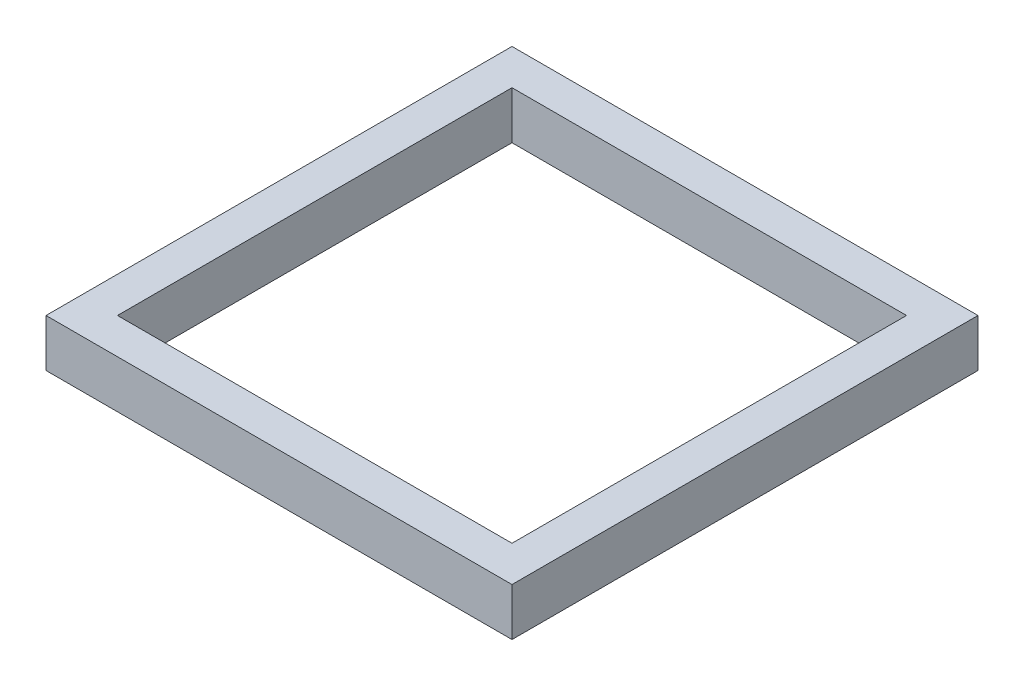
ISO-10303-21;
HEADER;
FILE_DESCRIPTION(('STEP AP214'),'2;1');
FILE_NAME('part.step','',(''),(''),'','','');
FILE_SCHEMA(('AUTOMOTIVE_DESIGN { 1 0 10303 214 1 1 1 1 }'));
ENDSEC;
DATA;
#1=APPLICATION_CONTEXT('core data for automotive mechanical design processes');
#2=APPLICATION_PROTOCOL_DEFINITION('international standard','automotive_design',2000,#1);
#3=PRODUCT_CONTEXT('',#1,'mechanical');
#4=PRODUCT('Part','Part','',(#3));
#5=PRODUCT_RELATED_PRODUCT_CATEGORY('part','',(#4));
#6=PRODUCT_DEFINITION_FORMATION('','',#4);
#7=PRODUCT_DEFINITION_CONTEXT('part definition',#1,'design');
#8=PRODUCT_DEFINITION('design','',#6,#7);
#9=PRODUCT_DEFINITION_SHAPE('','',#8);
#10=(LENGTH_UNIT() NAMED_UNIT(*) SI_UNIT(.MILLI.,.METRE.));
#11=(NAMED_UNIT(*) PLANE_ANGLE_UNIT() SI_UNIT($,.RADIAN.));
#12=(NAMED_UNIT(*) SI_UNIT($,.STERADIAN.) SOLID_ANGLE_UNIT());
#13=UNCERTAINTY_MEASURE_WITH_UNIT(LENGTH_MEASURE(1.E-05),#10,'distance_accuracy_value','');
#14=(GEOMETRIC_REPRESENTATION_CONTEXT(3) GLOBAL_UNCERTAINTY_ASSIGNED_CONTEXT((#13)) GLOBAL_UNIT_ASSIGNED_CONTEXT((#10,
#11,#12)) REPRESENTATION_CONTEXT('',''));
#15=CARTESIAN_POINT('',(0.,0.,0.));
#16=DIRECTION('',(0.,0.,1.));
#17=DIRECTION('',(1.,0.,0.));
#18=AXIS2_PLACEMENT_3D('',#15,#16,#17);
#19=CARTESIAN_POINT('',(0.,20.,0.));
#20=DIRECTION('',(0.,1.,0.));
#21=DIRECTION('',(0.,0.,1.));
#22=AXIS2_PLACEMENT_3D('',#19,#20,#21);
#23=PLANE('',#22);
#24=DIRECTION('',(0.,0.,1.));
#25=VECTOR('',#24,1.);
#26=CARTESIAN_POINT('',(-97.755,20.,97.755));
#27=LINE('',#26,#25);
#28=CARTESIAN_POINT('',(-97.755,20.,-97.755));
#29=VERTEX_POINT('',#28);
#30=CARTESIAN_POINT('',(-97.755,20.,97.755));
#31=VERTEX_POINT('',#30);
#32=EDGE_CURVE('E153',#29,#31,#27,.T.);
#33=ORIENTED_EDGE('',*,*,#32,.T.);
#34=DIRECTION('',(1.,0.,0.));
#35=VECTOR('',#34,1.);
#36=CARTESIAN_POINT('',(97.755,20.,97.755));
#37=LINE('',#36,#35);
#38=CARTESIAN_POINT('',(97.755,20.,97.755));
#39=VERTEX_POINT('',#38);
#40=EDGE_CURVE('E157',#31,#39,#37,.T.);
#41=ORIENTED_EDGE('',*,*,#40,.T.);
#42=DIRECTION('',(0.,0.,-1.));
#43=VECTOR('',#42,1.);
#44=CARTESIAN_POINT('',(97.755,20.,97.755));
#45=LINE('',#44,#43);
#46=CARTESIAN_POINT('',(97.755,20.,-97.755));
#47=VERTEX_POINT('',#46);
#48=EDGE_CURVE('E161',#39,#47,#45,.T.);
#49=ORIENTED_EDGE('',*,*,#48,.T.);
#50=DIRECTION('',(-1.,0.,0.));
#51=VECTOR('',#50,1.);
#52=CARTESIAN_POINT('',(97.755,20.,-97.755));
#53=LINE('',#52,#51);
#54=EDGE_CURVE('E164',#47,#29,#53,.T.);
#55=ORIENTED_EDGE('',*,*,#54,.T.);
#56=EDGE_LOOP('',(#33,#41,#49,#55));
#57=FACE_BOUND('',#56,.T.);
#58=DIRECTION('',(1.,0.,0.));
#59=VECTOR('',#58,1.);
#60=CARTESIAN_POINT('',(82.76,20.,82.76));
#61=LINE('',#60,#59);
#62=CARTESIAN_POINT('',(-82.76,20.,82.76));
#63=VERTEX_POINT('',#62);
#64=CARTESIAN_POINT('',(82.76,20.,82.76));
#65=VERTEX_POINT('',#64);
#66=EDGE_CURVE('E114',#63,#65,#61,.T.);
#67=ORIENTED_EDGE('',*,*,#66,.F.);
#68=DIRECTION('',(0.,0.,1.));
#69=VECTOR('',#68,1.);
#70=CARTESIAN_POINT('',(-82.76,20.,82.76));
#71=LINE('',#70,#69);
#72=CARTESIAN_POINT('',(-82.76,20.,-82.76));
#73=VERTEX_POINT('',#72);
#74=EDGE_CURVE('E105',#73,#63,#71,.T.);
#75=ORIENTED_EDGE('',*,*,#74,.F.);
#76=DIRECTION('',(-1.,0.,0.));
#77=VECTOR('',#76,1.);
#78=CARTESIAN_POINT('',(82.76,20.,-82.76));
#79=LINE('',#78,#77);
#80=CARTESIAN_POINT('',(82.76,20.,-82.76));
#81=VERTEX_POINT('',#80);
#82=EDGE_CURVE('E131',#81,#73,#79,.T.);
#83=ORIENTED_EDGE('',*,*,#82,.F.);
#84=DIRECTION('',(0.,0.,-1.));
#85=VECTOR('',#84,1.);
#86=CARTESIAN_POINT('',(82.76,20.,82.76));
#87=LINE('',#86,#85);
#88=EDGE_CURVE('E127',#65,#81,#87,.T.);
#89=ORIENTED_EDGE('',*,*,#88,.F.);
#90=EDGE_LOOP('',(#67,#75,#83,#89));
#91=FACE_BOUND('',#90,.T.);
#92=ADVANCED_FACE('F39',(#57,#91),#23,.T.);
#93=CARTESIAN_POINT('',(0.,0.,0.));
#94=DIRECTION('',(0.,1.,0.));
#95=DIRECTION('',(0.,0.,1.));
#96=AXIS2_PLACEMENT_3D('',#93,#94,#95);
#97=PLANE('',#96);
#98=DIRECTION('',(0.,0.,1.));
#99=VECTOR('',#98,1.);
#100=CARTESIAN_POINT('',(-97.755,0.,97.755));
#101=LINE('',#100,#99);
#102=CARTESIAN_POINT('',(-97.755,0.,-97.755));
#103=VERTEX_POINT('',#102);
#104=CARTESIAN_POINT('',(-97.755,0.,97.755));
#105=VERTEX_POINT('',#104);
#106=EDGE_CURVE('E123',#103,#105,#101,.T.);
#107=ORIENTED_EDGE('',*,*,#106,.F.);
#108=DIRECTION('',(-1.,0.,0.));
#109=VECTOR('',#108,1.);
#110=CARTESIAN_POINT('',(97.755,0.,-97.755));
#111=LINE('',#110,#109);
#112=CARTESIAN_POINT('',(97.755,0.,-97.755));
#113=VERTEX_POINT('',#112);
#114=EDGE_CURVE('E158',#113,#103,#111,.T.);
#115=ORIENTED_EDGE('',*,*,#114,.F.);
#116=DIRECTION('',(0.,0.,-1.));
#117=VECTOR('',#116,1.);
#118=CARTESIAN_POINT('',(97.755,0.,97.755));
#119=LINE('',#118,#117);
#120=CARTESIAN_POINT('',(97.755,0.,97.755));
#121=VERTEX_POINT('',#120);
#122=EDGE_CURVE('E174',#121,#113,#119,.T.);
#123=ORIENTED_EDGE('',*,*,#122,.F.);
#124=DIRECTION('',(1.,0.,0.));
#125=VECTOR('',#124,1.);
#126=CARTESIAN_POINT('',(97.755,0.,97.755));
#127=LINE('',#126,#125);
#128=EDGE_CURVE('E171',#105,#121,#127,.T.);
#129=ORIENTED_EDGE('',*,*,#128,.F.);
#130=EDGE_LOOP('',(#107,#115,#123,#129));
#131=FACE_BOUND('',#130,.T.);
#132=DIRECTION('',(0.,0.,1.));
#133=VECTOR('',#132,1.);
#134=CARTESIAN_POINT('',(-82.76,0.,82.76));
#135=LINE('',#134,#133);
#136=CARTESIAN_POINT('',(-82.76,0.,-82.76));
#137=VERTEX_POINT('',#136);
#138=CARTESIAN_POINT('',(-82.76,0.,82.76));
#139=VERTEX_POINT('',#138);
#140=EDGE_CURVE('E63',#137,#139,#135,.T.);
#141=ORIENTED_EDGE('',*,*,#140,.T.);
#142=DIRECTION('',(1.,0.,0.));
#143=VECTOR('',#142,1.);
#144=CARTESIAN_POINT('',(82.76,0.,82.76));
#145=LINE('',#144,#143);
#146=CARTESIAN_POINT('',(82.76,0.,82.76));
#147=VERTEX_POINT('',#146);
#148=EDGE_CURVE('E121',#139,#147,#145,.T.);
#149=ORIENTED_EDGE('',*,*,#148,.T.);
#150=DIRECTION('',(0.,0.,-1.));
#151=VECTOR('',#150,1.);
#152=CARTESIAN_POINT('',(82.76,0.,82.76));
#153=LINE('',#152,#151);
#154=CARTESIAN_POINT('',(82.76,0.,-82.76));
#155=VERTEX_POINT('',#154);
#156=EDGE_CURVE('E140',#147,#155,#153,.T.);
#157=ORIENTED_EDGE('',*,*,#156,.T.);
#158=DIRECTION('',(-1.,0.,0.));
#159=VECTOR('',#158,1.);
#160=CARTESIAN_POINT('',(82.76,0.,-82.76));
#161=LINE('',#160,#159);
#162=EDGE_CURVE('E115',#155,#137,#161,.T.);
#163=ORIENTED_EDGE('',*,*,#162,.T.);
#164=EDGE_LOOP('',(#141,#149,#157,#163));
#165=FACE_BOUND('',#164,.T.);
#166=ADVANCED_FACE('F197',(#131,#165),#97,.F.);
#167=CARTESIAN_POINT('',(-97.755,20.,97.755));
#168=DIRECTION('',(1.,0.,0.));
#169=DIRECTION('',(0.,0.,-1.));
#170=AXIS2_PLACEMENT_3D('',#167,#168,#169);
#171=PLANE('',#170);
#172=ORIENTED_EDGE('',*,*,#106,.T.);
#173=DIRECTION('',(0.,-1.,0.));
#174=VECTOR('',#173,1.);
#175=CARTESIAN_POINT('',(-97.755,20.,97.755));
#176=LINE('',#175,#174);
#177=EDGE_CURVE('E11',#31,#105,#176,.T.);
#178=ORIENTED_EDGE('',*,*,#177,.F.);
#179=ORIENTED_EDGE('',*,*,#32,.F.);
#180=DIRECTION('',(0.,-1.,0.));
#181=VECTOR('',#180,1.);
#182=CARTESIAN_POINT('',(-97.755,20.,-97.755));
#183=LINE('',#182,#181);
#184=EDGE_CURVE('E167',#29,#103,#183,.T.);
#185=ORIENTED_EDGE('',*,*,#184,.T.);
#186=EDGE_LOOP('',(#172,#178,#179,#185));
#187=FACE_BOUND('',#186,.T.);
#188=ADVANCED_FACE('F41',(#187),#171,.F.);
#189=CARTESIAN_POINT('',(97.755,20.,97.755));
#190=DIRECTION('',(0.,0.,-1.));
#191=DIRECTION('',(-1.,0.,0.));
#192=AXIS2_PLACEMENT_3D('',#189,#190,#191);
#193=PLANE('',#192);
#194=ORIENTED_EDGE('',*,*,#128,.T.);
#195=DIRECTION('',(0.,-1.,0.));
#196=VECTOR('',#195,1.);
#197=CARTESIAN_POINT('',(97.755,20.,97.755));
#198=LINE('',#197,#196);
#199=EDGE_CURVE('E48',#39,#121,#198,.T.);
#200=ORIENTED_EDGE('',*,*,#199,.F.);
#201=ORIENTED_EDGE('',*,*,#40,.F.);
#202=ORIENTED_EDGE('',*,*,#177,.T.);
#203=EDGE_LOOP('',(#194,#200,#201,#202));
#204=FACE_BOUND('',#203,.T.);
#205=ADVANCED_FACE('F207',(#204),#193,.F.);
#206=CARTESIAN_POINT('',(97.755,20.,97.755));
#207=DIRECTION('',(-1.,0.,0.));
#208=DIRECTION('',(0.,0.,1.));
#209=AXIS2_PLACEMENT_3D('',#206,#207,#208);
#210=PLANE('',#209);
#211=ORIENTED_EDGE('',*,*,#122,.T.);
#212=DIRECTION('',(0.,-1.,0.));
#213=VECTOR('',#212,1.);
#214=CARTESIAN_POINT('',(97.755,20.,-97.755));
#215=LINE('',#214,#213);
#216=EDGE_CURVE('E182',#47,#113,#215,.T.);
#217=ORIENTED_EDGE('',*,*,#216,.F.);
#218=ORIENTED_EDGE('',*,*,#48,.F.);
#219=ORIENTED_EDGE('',*,*,#199,.T.);
#220=EDGE_LOOP('',(#211,#217,#218,#219));
#221=FACE_BOUND('',#220,.T.);
#222=ADVANCED_FACE('F191',(#221),#210,.F.);
#223=CARTESIAN_POINT('',(97.755,20.,-97.755));
#224=DIRECTION('',(0.,0.,1.));
#225=DIRECTION('',(1.,0.,0.));
#226=AXIS2_PLACEMENT_3D('',#223,#224,#225);
#227=PLANE('',#226);
#228=ORIENTED_EDGE('',*,*,#114,.T.);
#229=ORIENTED_EDGE('',*,*,#184,.F.);
#230=ORIENTED_EDGE('',*,*,#54,.F.);
#231=ORIENTED_EDGE('',*,*,#216,.T.);
#232=EDGE_LOOP('',(#228,#229,#230,#231));
#233=FACE_BOUND('',#232,.T.);
#234=ADVANCED_FACE('F201',(#233),#227,.F.);
#235=CARTESIAN_POINT('',(-82.76,20.,82.76));
#236=DIRECTION('',(1.,0.,0.));
#237=DIRECTION('',(0.,0.,-1.));
#238=AXIS2_PLACEMENT_3D('',#235,#236,#237);
#239=PLANE('',#238);
#240=ORIENTED_EDGE('',*,*,#140,.F.);
#241=DIRECTION('',(0.,-1.,0.));
#242=VECTOR('',#241,1.);
#243=CARTESIAN_POINT('',(-82.76,20.,-82.76));
#244=LINE('',#243,#242);
#245=EDGE_CURVE('E109',#73,#137,#244,.T.);
#246=ORIENTED_EDGE('',*,*,#245,.F.);
#247=ORIENTED_EDGE('',*,*,#74,.T.);
#248=DIRECTION('',(0.,-1.,0.));
#249=VECTOR('',#248,1.);
#250=CARTESIAN_POINT('',(-82.76,20.,82.76));
#251=LINE('',#250,#249);
#252=EDGE_CURVE('E108',#63,#139,#251,.T.);
#253=ORIENTED_EDGE('',*,*,#252,.T.);
#254=EDGE_LOOP('',(#240,#246,#247,#253));
#255=FACE_BOUND('',#254,.T.);
#256=ADVANCED_FACE('F107',(#255),#239,.T.);
#257=CARTESIAN_POINT('',(82.76,20.,82.76));
#258=DIRECTION('',(0.,0.,-1.));
#259=DIRECTION('',(-1.,0.,0.));
#260=AXIS2_PLACEMENT_3D('',#257,#258,#259);
#261=PLANE('',#260);
#262=ORIENTED_EDGE('',*,*,#148,.F.);
#263=ORIENTED_EDGE('',*,*,#252,.F.);
#264=ORIENTED_EDGE('',*,*,#66,.T.);
#265=DIRECTION('',(0.,-1.,0.));
#266=VECTOR('',#265,1.);
#267=CARTESIAN_POINT('',(82.76,20.,82.76));
#268=LINE('',#267,#266);
#269=EDGE_CURVE('E124',#65,#147,#268,.T.);
#270=ORIENTED_EDGE('',*,*,#269,.T.);
#271=EDGE_LOOP('',(#262,#263,#264,#270));
#272=FACE_BOUND('',#271,.T.);
#273=ADVANCED_FACE('F118',(#272),#261,.T.);
#274=CARTESIAN_POINT('',(82.76,20.,82.76));
#275=DIRECTION('',(-1.,0.,0.));
#276=DIRECTION('',(0.,0.,1.));
#277=AXIS2_PLACEMENT_3D('',#274,#275,#276);
#278=PLANE('',#277);
#279=ORIENTED_EDGE('',*,*,#156,.F.);
#280=ORIENTED_EDGE('',*,*,#269,.F.);
#281=ORIENTED_EDGE('',*,*,#88,.T.);
#282=DIRECTION('',(0.,-1.,0.));
#283=VECTOR('',#282,1.);
#284=CARTESIAN_POINT('',(82.76,20.,-82.76));
#285=LINE('',#284,#283);
#286=EDGE_CURVE('E55',#81,#155,#285,.T.);
#287=ORIENTED_EDGE('',*,*,#286,.T.);
#288=EDGE_LOOP('',(#279,#280,#281,#287));
#289=FACE_BOUND('',#288,.T.);
#290=ADVANCED_FACE('F230',(#289),#278,.T.);
#291=CARTESIAN_POINT('',(82.76,20.,-82.76));
#292=DIRECTION('',(0.,0.,1.));
#293=DIRECTION('',(1.,0.,0.));
#294=AXIS2_PLACEMENT_3D('',#291,#292,#293);
#295=PLANE('',#294);
#296=ORIENTED_EDGE('',*,*,#162,.F.);
#297=ORIENTED_EDGE('',*,*,#286,.F.);
#298=ORIENTED_EDGE('',*,*,#82,.T.);
#299=ORIENTED_EDGE('',*,*,#245,.T.);
#300=EDGE_LOOP('',(#296,#297,#298,#299));
#301=FACE_BOUND('',#300,.T.);
#302=ADVANCED_FACE('F234',(#301),#295,.T.);
#303=CLOSED_SHELL('',(#92,#166,#188,#205,#222,#234,#256,#273,#290,#302));
#304=MANIFOLD_SOLID_BREP('B2',#303);
#305=ADVANCED_BREP_SHAPE_REPRESENTATION('',(#18,#304),#14);
#306=SHAPE_DEFINITION_REPRESENTATION(#9,#305);
ENDSEC;
END-ISO-10303-21;
